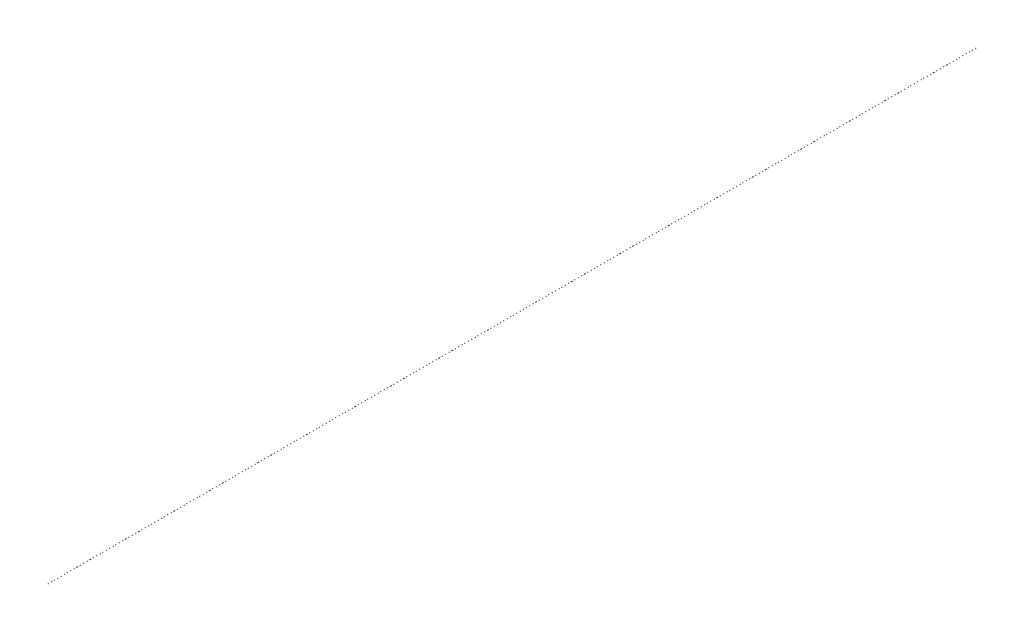
ISO-10303-21;
HEADER;
FILE_DESCRIPTION(('STEP AP214'),'2;1');
FILE_NAME('part.step','',(''),(''),'','','');
FILE_SCHEMA(('AUTOMOTIVE_DESIGN { 1 0 10303 214 1 1 1 1 }'));
ENDSEC;
DATA;
#1=APPLICATION_CONTEXT('core data for automotive mechanical design processes');
#2=APPLICATION_PROTOCOL_DEFINITION('international standard','automotive_design',2000,#1);
#3=PRODUCT_CONTEXT('',#1,'mechanical');
#4=PRODUCT('Part','Part','',(#3));
#5=PRODUCT_RELATED_PRODUCT_CATEGORY('part','',(#4));
#6=PRODUCT_DEFINITION_FORMATION('','',#4);
#7=PRODUCT_DEFINITION_CONTEXT('part definition',#1,'design');
#8=PRODUCT_DEFINITION('design','',#6,#7);
#9=PRODUCT_DEFINITION_SHAPE('','',#8);
#10=(LENGTH_UNIT() NAMED_UNIT(*) SI_UNIT(.MILLI.,.METRE.));
#11=(NAMED_UNIT(*) PLANE_ANGLE_UNIT() SI_UNIT($,.RADIAN.));
#12=(NAMED_UNIT(*) SI_UNIT($,.STERADIAN.) SOLID_ANGLE_UNIT());
#13=UNCERTAINTY_MEASURE_WITH_UNIT(LENGTH_MEASURE(1.E-05),#10,'distance_accuracy_value','');
#14=(GEOMETRIC_REPRESENTATION_CONTEXT(3) GLOBAL_UNCERTAINTY_ASSIGNED_CONTEXT((#13)) GLOBAL_UNIT_ASSIGNED_CONTEXT((#10,
#11,#12)) REPRESENTATION_CONTEXT('',''));
#15=CARTESIAN_POINT('',(0.,0.,0.));
#16=DIRECTION('',(0.,0.,1.));
#17=DIRECTION('',(1.,0.,0.));
#18=AXIS2_PLACEMENT_3D('',#15,#16,#17);
#19=CARTESIAN_POINT('',(-0.156931248019243,0.0044853162208003,-1234.095));
#20=DIRECTION('',(-0.818514752210674,0.574485509315507,0.));
#21=DIRECTION('',(-0.574485509315507,-0.818514752210675,0.));
#22=AXIS2_PLACEMENT_3D('',#19,#20,#21);
#23=PLANE('',#22);
#24=DIRECTION('',(-0.574485509315507,-0.818514752210675,0.));
#25=VECTOR('',#24,1.);
#26=CARTESIAN_POINT('',(-0.156931248019243,0.0044853162208003,0.));
#27=LINE('',#26,#25);
#28=CARTESIAN_POINT('',(-0.0909035024817942,0.0985602457033699,0.));
#29=VERTEX_POINT('',#28);
#30=CARTESIAN_POINT('',(-0.156931248019243,0.0044853162208003,0.));
#31=VERTEX_POINT('',#30);
#32=EDGE_CURVE('E97',#29,#31,#27,.T.);
#33=ORIENTED_EDGE('',*,*,#32,.F.);
#34=DIRECTION('',(0.,0.,1.));
#35=VECTOR('',#34,1.);
#36=CARTESIAN_POINT('',(-0.0909035024817942,0.0985602457033699,-1234.095));
#37=LINE('',#36,#35);
#38=CARTESIAN_POINT('',(-0.0909035024817942,0.0985602457033699,-2468.19));
#39=VERTEX_POINT('',#38);
#40=EDGE_CURVE('E11',#39,#29,#37,.T.);
#41=ORIENTED_EDGE('',*,*,#40,.F.);
#42=DIRECTION('',(-0.574485509315507,-0.818514752210675,0.));
#43=VECTOR('',#42,1.);
#44=CARTESIAN_POINT('',(-0.156931248019243,0.0044853162208003,-2468.19));
#45=LINE('',#44,#43);
#46=CARTESIAN_POINT('',(-0.156931248019243,0.0044853162208003,-2468.19));
#47=VERTEX_POINT('',#46);
#48=EDGE_CURVE('E89',#39,#47,#45,.T.);
#49=ORIENTED_EDGE('',*,*,#48,.T.);
#50=DIRECTION('',(0.,0.,1.));
#51=VECTOR('',#50,1.);
#52=CARTESIAN_POINT('',(-0.156931248019243,0.0044853162208003,-1234.095));
#53=LINE('',#52,#51);
#54=EDGE_CURVE('E36',#47,#31,#53,.T.);
#55=ORIENTED_EDGE('',*,*,#54,.T.);
#56=EDGE_LOOP('',(#33,#41,#49,#55));
#57=FACE_BOUND('',#56,.T.);
#58=ADVANCED_FACE('F33',(#57),#23,.T.);
#59=CARTESIAN_POINT('',(-0.0909035024817942,0.0985602457033699,-1234.095));
#60=DIRECTION('',(0.574485509315507,0.818514752210675,0.));
#61=DIRECTION('',(-0.818514752210675,0.574485509315507,0.));
#62=AXIS2_PLACEMENT_3D('',#59,#60,#61);
#63=PLANE('',#62);
#64=DIRECTION('',(-0.818514752210675,0.574485509315507,0.));
#65=VECTOR('',#64,1.);
#66=CARTESIAN_POINT('',(-0.0909035024817942,0.0985602457033699,0.));
#67=LINE('',#66,#65);
#68=CARTESIAN_POINT('',(0.00806702305516614,0.0290964606991751,0.));
#69=VERTEX_POINT('',#68);
#70=EDGE_CURVE('E84',#69,#29,#67,.T.);
#71=ORIENTED_EDGE('',*,*,#70,.F.);
#72=DIRECTION('',(0.,0.,1.));
#73=VECTOR('',#72,1.);
#74=CARTESIAN_POINT('',(0.00806702305516614,0.0290964606991751,-1234.095));
#75=LINE('',#74,#73);
#76=CARTESIAN_POINT('',(0.00806702305516614,0.0290964606991751,-2468.19));
#77=VERTEX_POINT('',#76);
#78=EDGE_CURVE('E41',#77,#69,#75,.T.);
#79=ORIENTED_EDGE('',*,*,#78,.F.);
#80=DIRECTION('',(-0.818514752210675,0.574485509315507,0.));
#81=VECTOR('',#80,1.);
#82=CARTESIAN_POINT('',(-0.0909035024817942,0.0985602457033699,-2468.19));
#83=LINE('',#82,#81);
#84=EDGE_CURVE('E95',#77,#39,#83,.T.);
#85=ORIENTED_EDGE('',*,*,#84,.T.);
#86=ORIENTED_EDGE('',*,*,#40,.T.);
#87=EDGE_LOOP('',(#71,#79,#85,#86));
#88=FACE_BOUND('',#87,.T.);
#89=ADVANCED_FACE('F107',(#88),#63,.T.);
#90=CARTESIAN_POINT('',(-0.0579607224822827,-0.0649784687833945,-1234.095));
#91=DIRECTION('',(0.818514752210675,-0.574485509315507,0.));
#92=DIRECTION('',(0.574485509315507,0.818514752210675,0.));
#93=AXIS2_PLACEMENT_3D('',#90,#91,#92);
#94=PLANE('',#93);
#95=DIRECTION('',(0.574485509315507,0.818514752210675,0.));
#96=VECTOR('',#95,1.);
#97=CARTESIAN_POINT('',(-0.0579607224822827,-0.0649784687833945,0.));
#98=LINE('',#97,#96);
#99=CARTESIAN_POINT('',(-0.0579607224822827,-0.0649784687833945,0.));
#100=VERTEX_POINT('',#99);
#101=EDGE_CURVE('E100',#100,#69,#98,.T.);
#102=ORIENTED_EDGE('',*,*,#101,.F.);
#103=DIRECTION('',(0.,0.,1.));
#104=VECTOR('',#103,1.);
#105=CARTESIAN_POINT('',(-0.0579607224822827,-0.0649784687833945,-1234.095));
#106=LINE('',#105,#104);
#107=CARTESIAN_POINT('',(-0.0579607224822827,-0.0649784687833945,-2468.19));
#108=VERTEX_POINT('',#107);
#109=EDGE_CURVE('E83',#108,#100,#106,.T.);
#110=ORIENTED_EDGE('',*,*,#109,.F.);
#111=DIRECTION('',(0.574485509315507,0.818514752210675,0.));
#112=VECTOR('',#111,1.);
#113=CARTESIAN_POINT('',(-0.0579607224822827,-0.0649784687833945,-2468.19));
#114=LINE('',#113,#112);
#115=EDGE_CURVE('E90',#108,#77,#114,.T.);
#116=ORIENTED_EDGE('',*,*,#115,.T.);
#117=ORIENTED_EDGE('',*,*,#78,.T.);
#118=EDGE_LOOP('',(#102,#110,#116,#117));
#119=FACE_BOUND('',#118,.T.);
#120=ADVANCED_FACE('F104',(#119),#94,.T.);
#121=CARTESIAN_POINT('',(-0.156931248019243,0.0044853162208003,-1234.095));
#122=DIRECTION('',(-0.574485509315507,-0.818514752210675,0.));
#123=DIRECTION('',(0.818514752210675,-0.574485509315507,0.));
#124=AXIS2_PLACEMENT_3D('',#121,#122,#123);
#125=PLANE('',#124);
#126=DIRECTION('',(0.818514752210675,-0.574485509315507,0.));
#127=VECTOR('',#126,1.);
#128=CARTESIAN_POINT('',(-0.156931248019243,0.0044853162208003,0.));
#129=LINE('',#128,#127);
#130=EDGE_CURVE('E79',#31,#100,#129,.T.);
#131=ORIENTED_EDGE('',*,*,#130,.F.);
#132=ORIENTED_EDGE('',*,*,#54,.F.);
#133=DIRECTION('',(0.818514752210675,-0.574485509315507,0.));
#134=VECTOR('',#133,1.);
#135=CARTESIAN_POINT('',(-0.156931248019243,0.0044853162208003,-2468.19));
#136=LINE('',#135,#134);
#137=EDGE_CURVE('E76',#47,#108,#136,.T.);
#138=ORIENTED_EDGE('',*,*,#137,.T.);
#139=ORIENTED_EDGE('',*,*,#109,.T.);
#140=EDGE_LOOP('',(#131,#132,#138,#139));
#141=FACE_BOUND('',#140,.T.);
#142=ADVANCED_FACE('F75',(#141),#125,.T.);
#143=CARTESIAN_POINT('',(0.,0.,0.));
#144=DIRECTION('',(0.,0.,-1.));
#145=DIRECTION('',(-1.,0.,0.));
#146=AXIS2_PLACEMENT_3D('',#143,#144,#145);
#147=PLANE('',#146);
#148=ORIENTED_EDGE('',*,*,#32,.T.);
#149=ORIENTED_EDGE('',*,*,#130,.T.);
#150=ORIENTED_EDGE('',*,*,#101,.T.);
#151=ORIENTED_EDGE('',*,*,#70,.T.);
#152=EDGE_LOOP('',(#148,#149,#150,#151));
#153=FACE_BOUND('',#152,.T.);
#154=ADVANCED_FACE('F106',(#153),#147,.F.);
#155=CARTESIAN_POINT('',(0.,0.,-2468.19));
#156=DIRECTION('',(0.,0.,1.));
#157=DIRECTION('',(-1.,0.,0.));
#158=AXIS2_PLACEMENT_3D('',#155,#156,#157);
#159=PLANE('',#158);
#160=ORIENTED_EDGE('',*,*,#48,.F.);
#161=ORIENTED_EDGE('',*,*,#84,.F.);
#162=ORIENTED_EDGE('',*,*,#115,.F.);
#163=ORIENTED_EDGE('',*,*,#137,.F.);
#164=EDGE_LOOP('',(#160,#161,#162,#163));
#165=FACE_BOUND('',#164,.T.);
#166=ADVANCED_FACE('F87',(#165),#159,.F.);
#167=CLOSED_SHELL('',(#58,#89,#120,#142,#154,#166));
#168=MANIFOLD_SOLID_BREP('B2',#167);
#169=ADVANCED_BREP_SHAPE_REPRESENTATION('',(#18,#168),#14);
#170=SHAPE_DEFINITION_REPRESENTATION(#9,#169);
ENDSEC;
END-ISO-10303-21;
